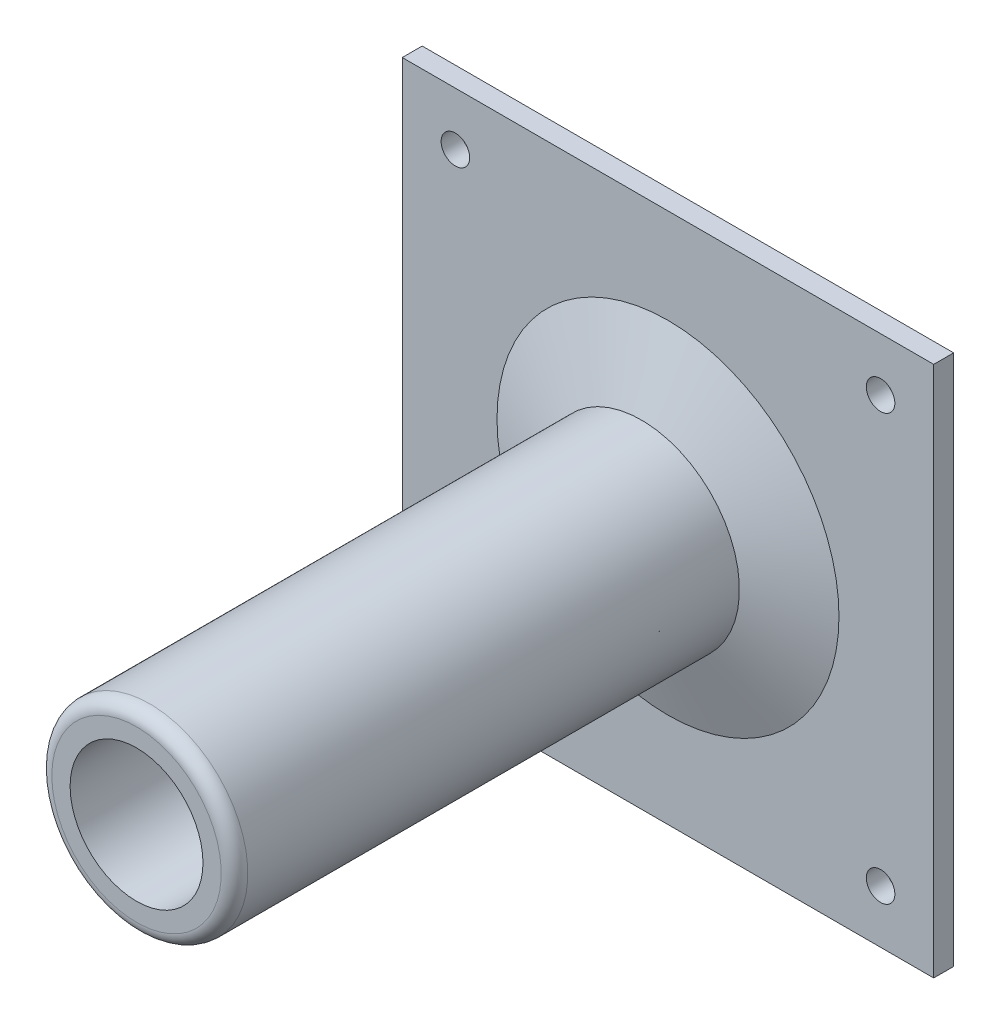
ISO-10303-21;
HEADER;
FILE_DESCRIPTION(('STEP AP214'),'2;1');
FILE_NAME('part.step','',(''),(''),'','','');
FILE_SCHEMA(('AUTOMOTIVE_DESIGN { 1 0 10303 214 1 1 1 1 }'));
ENDSEC;
DATA;
#1=APPLICATION_CONTEXT('core data for automotive mechanical design processes');
#2=APPLICATION_PROTOCOL_DEFINITION('international standard','automotive_design',2000,#1);
#3=PRODUCT_CONTEXT('',#1,'mechanical');
#4=PRODUCT('Part','Part','',(#3));
#5=PRODUCT_RELATED_PRODUCT_CATEGORY('part','',(#4));
#6=PRODUCT_DEFINITION_FORMATION('','',#4);
#7=PRODUCT_DEFINITION_CONTEXT('part definition',#1,'design');
#8=PRODUCT_DEFINITION('design','',#6,#7);
#9=PRODUCT_DEFINITION_SHAPE('','',#8);
#10=(LENGTH_UNIT() NAMED_UNIT(*) SI_UNIT(.MILLI.,.METRE.));
#11=(NAMED_UNIT(*) PLANE_ANGLE_UNIT() SI_UNIT($,.RADIAN.));
#12=(NAMED_UNIT(*) SI_UNIT($,.STERADIAN.) SOLID_ANGLE_UNIT());
#13=UNCERTAINTY_MEASURE_WITH_UNIT(LENGTH_MEASURE(1.E-05),#10,'distance_accuracy_value','');
#14=(GEOMETRIC_REPRESENTATION_CONTEXT(3) GLOBAL_UNCERTAINTY_ASSIGNED_CONTEXT((#13)) GLOBAL_UNIT_ASSIGNED_CONTEXT((#10,
#11,#12)) REPRESENTATION_CONTEXT('',''));
#15=CARTESIAN_POINT('',(0.,0.,0.));
#16=DIRECTION('',(0.,0.,1.));
#17=DIRECTION('',(1.,0.,0.));
#18=AXIS2_PLACEMENT_3D('',#15,#16,#17);
#19=CARTESIAN_POINT('',(0.,0.,3.));
#20=DIRECTION('',(0.,0.,-1.));
#21=DIRECTION('',(-1.,0.,0.));
#22=AXIS2_PLACEMENT_3D('',#19,#20,#21);
#23=PLANE('',#22);
#24=CARTESIAN_POINT('',(-32.,32.,3.));
#25=DIRECTION('',(0.,0.,1.));
#26=DIRECTION('',(1.,0.,0.));
#27=AXIS2_PLACEMENT_3D('',#24,#25,#26);
#28=CIRCLE('',#27,2.15);
#29=CARTESIAN_POINT('',(-29.85,32.,3.));
#30=VERTEX_POINT('',#29);
#31=EDGE_CURVE('E218',#30,#30,#28,.T.);
#32=ORIENTED_EDGE('',*,*,#31,.F.);
#33=EDGE_LOOP('',(#32));
#34=FACE_BOUND('',#33,.T.);
#35=CARTESIAN_POINT('',(32.,-32.,3.));
#36=DIRECTION('',(0.,0.,1.));
#37=DIRECTION('',(1.,0.,0.));
#38=AXIS2_PLACEMENT_3D('',#35,#36,#37);
#39=CIRCLE('',#38,2.15);
#40=CARTESIAN_POINT('',(34.15,-32.,3.));
#41=VERTEX_POINT('',#40);
#42=EDGE_CURVE('E232',#41,#41,#39,.T.);
#43=ORIENTED_EDGE('',*,*,#42,.F.);
#44=EDGE_LOOP('',(#43));
#45=FACE_BOUND('',#44,.T.);
#46=CARTESIAN_POINT('',(0.,0.,3.));
#47=DIRECTION('',(0.,0.,-1.));
#48=DIRECTION('',(-1.,0.,0.));
#49=AXIS2_PLACEMENT_3D('',#46,#47,#48);
#50=CIRCLE('',#49,25.7399096778187);
#51=CARTESIAN_POINT('',(-25.7399096778187,0.,3.));
#52=VERTEX_POINT('',#51);
#53=EDGE_CURVE('E117',#52,#52,#50,.T.);
#54=ORIENTED_EDGE('',*,*,#53,.T.);
#55=EDGE_LOOP('',(#54));
#56=FACE_BOUND('',#55,.T.);
#57=DIRECTION('',(0.,1.,0.));
#58=VECTOR('',#57,1.);
#59=CARTESIAN_POINT('',(40.,-40.,3.));
#60=LINE('',#59,#58);
#61=CARTESIAN_POINT('',(40.,-40.,3.));
#62=VERTEX_POINT('',#61);
#63=CARTESIAN_POINT('',(40.,40.,3.));
#64=VERTEX_POINT('',#63);
#65=EDGE_CURVE('E86',#62,#64,#60,.T.);
#66=ORIENTED_EDGE('',*,*,#65,.T.);
#67=DIRECTION('',(-1.,0.,0.));
#68=VECTOR('',#67,1.);
#69=CARTESIAN_POINT('',(-40.,40.,3.));
#70=LINE('',#69,#68);
#71=CARTESIAN_POINT('',(-40.,40.,3.));
#72=VERTEX_POINT('',#71);
#73=EDGE_CURVE('E81',#64,#72,#70,.T.);
#74=ORIENTED_EDGE('',*,*,#73,.T.);
#75=DIRECTION('',(0.,-1.,0.));
#76=VECTOR('',#75,1.);
#77=CARTESIAN_POINT('',(-40.,-40.,3.));
#78=LINE('',#77,#76);
#79=CARTESIAN_POINT('',(-40.,-40.,3.));
#80=VERTEX_POINT('',#79);
#81=EDGE_CURVE('E84',#72,#80,#78,.T.);
#82=ORIENTED_EDGE('',*,*,#81,.T.);
#83=DIRECTION('',(1.,0.,0.));
#84=VECTOR('',#83,1.);
#85=CARTESIAN_POINT('',(-40.,-40.,3.));
#86=LINE('',#85,#84);
#87=EDGE_CURVE('E50',#80,#62,#86,.T.);
#88=ORIENTED_EDGE('',*,*,#87,.T.);
#89=EDGE_LOOP('',(#66,#74,#82,#88));
#90=FACE_BOUND('',#89,.T.);
#91=CARTESIAN_POINT('',(32.,32.,3.));
#92=DIRECTION('',(0.,0.,1.));
#93=DIRECTION('',(1.,0.,0.));
#94=AXIS2_PLACEMENT_3D('',#91,#92,#93);
#95=CIRCLE('',#94,2.15);
#96=CARTESIAN_POINT('',(34.15,32.,3.));
#97=VERTEX_POINT('',#96);
#98=EDGE_CURVE('E226',#97,#97,#95,.T.);
#99=ORIENTED_EDGE('',*,*,#98,.F.);
#100=EDGE_LOOP('',(#99));
#101=FACE_BOUND('',#100,.T.);
#102=CARTESIAN_POINT('',(-32.,-32.,3.));
#103=DIRECTION('',(0.,0.,1.));
#104=DIRECTION('',(1.,0.,0.));
#105=AXIS2_PLACEMENT_3D('',#102,#103,#104);
#106=CIRCLE('',#105,2.15);
#107=CARTESIAN_POINT('',(-29.85,-32.,3.));
#108=VERTEX_POINT('',#107);
#109=EDGE_CURVE('E215',#108,#108,#106,.T.);
#110=ORIENTED_EDGE('',*,*,#109,.F.);
#111=EDGE_LOOP('',(#110));
#112=FACE_BOUND('',#111,.T.);
#113=ADVANCED_FACE('F33',(#34,#45,#56,#90,#101,#112),#23,.F.);
#114=CARTESIAN_POINT('',(40.,-40.,3.));
#115=DIRECTION('',(-1.,0.,0.));
#116=DIRECTION('',(0.,0.,1.));
#117=AXIS2_PLACEMENT_3D('',#114,#115,#116);
#118=PLANE('',#117);
#119=DIRECTION('',(0.,1.,0.));
#120=VECTOR('',#119,1.);
#121=CARTESIAN_POINT('',(40.,-40.,0.));
#122=LINE('',#121,#120);
#123=CARTESIAN_POINT('',(40.,-40.,0.));
#124=VERTEX_POINT('',#123);
#125=CARTESIAN_POINT('',(40.,40.,0.));
#126=VERTEX_POINT('',#125);
#127=EDGE_CURVE('E101',#124,#126,#122,.T.);
#128=ORIENTED_EDGE('',*,*,#127,.T.);
#129=DIRECTION('',(0.,0.,-1.));
#130=VECTOR('',#129,1.);
#131=CARTESIAN_POINT('',(40.,40.,3.));
#132=LINE('',#131,#130);
#133=EDGE_CURVE('E92',#64,#126,#132,.T.);
#134=ORIENTED_EDGE('',*,*,#133,.F.);
#135=ORIENTED_EDGE('',*,*,#65,.F.);
#136=DIRECTION('',(0.,0.,-1.));
#137=VECTOR('',#136,1.);
#138=CARTESIAN_POINT('',(40.,-40.,3.));
#139=LINE('',#138,#137);
#140=EDGE_CURVE('E97',#62,#124,#139,.T.);
#141=ORIENTED_EDGE('',*,*,#140,.T.);
#142=EDGE_LOOP('',(#128,#134,#135,#141));
#143=FACE_BOUND('',#142,.T.);
#144=ADVANCED_FACE('F144',(#143),#118,.F.);
#145=CARTESIAN_POINT('',(-40.,40.,3.));
#146=DIRECTION('',(0.,-1.,0.));
#147=DIRECTION('',(0.,0.,-1.));
#148=AXIS2_PLACEMENT_3D('',#145,#146,#147);
#149=PLANE('',#148);
#150=DIRECTION('',(-1.,0.,0.));
#151=VECTOR('',#150,1.);
#152=CARTESIAN_POINT('',(-40.,40.,0.));
#153=LINE('',#152,#151);
#154=CARTESIAN_POINT('',(-40.,40.,0.));
#155=VERTEX_POINT('',#154);
#156=EDGE_CURVE('E91',#126,#155,#153,.T.);
#157=ORIENTED_EDGE('',*,*,#156,.T.);
#158=DIRECTION('',(0.,0.,-1.));
#159=VECTOR('',#158,1.);
#160=CARTESIAN_POINT('',(-40.,40.,3.));
#161=LINE('',#160,#159);
#162=EDGE_CURVE('E89',#72,#155,#161,.T.);
#163=ORIENTED_EDGE('',*,*,#162,.F.);
#164=ORIENTED_EDGE('',*,*,#73,.F.);
#165=ORIENTED_EDGE('',*,*,#133,.T.);
#166=EDGE_LOOP('',(#157,#163,#164,#165));
#167=FACE_BOUND('',#166,.T.);
#168=ADVANCED_FACE('F90',(#167),#149,.F.);
#169=CARTESIAN_POINT('',(-40.,-40.,3.));
#170=DIRECTION('',(1.,0.,0.));
#171=DIRECTION('',(0.,0.,-1.));
#172=AXIS2_PLACEMENT_3D('',#169,#170,#171);
#173=PLANE('',#172);
#174=DIRECTION('',(0.,-1.,0.));
#175=VECTOR('',#174,1.);
#176=CARTESIAN_POINT('',(-40.,-40.,0.));
#177=LINE('',#176,#175);
#178=CARTESIAN_POINT('',(-40.,-40.,0.));
#179=VERTEX_POINT('',#178);
#180=EDGE_CURVE('E67',#155,#179,#177,.T.);
#181=ORIENTED_EDGE('',*,*,#180,.T.);
#182=DIRECTION('',(0.,0.,-1.));
#183=VECTOR('',#182,1.);
#184=CARTESIAN_POINT('',(-40.,-40.,3.));
#185=LINE('',#184,#183);
#186=EDGE_CURVE('E93',#80,#179,#185,.T.);
#187=ORIENTED_EDGE('',*,*,#186,.F.);
#188=ORIENTED_EDGE('',*,*,#81,.F.);
#189=ORIENTED_EDGE('',*,*,#162,.T.);
#190=EDGE_LOOP('',(#181,#187,#188,#189));
#191=FACE_BOUND('',#190,.T.);
#192=ADVANCED_FACE('F95',(#191),#173,.F.);
#193=CARTESIAN_POINT('',(-40.,-40.,3.));
#194=DIRECTION('',(0.,1.,0.));
#195=DIRECTION('',(0.,0.,1.));
#196=AXIS2_PLACEMENT_3D('',#193,#194,#195);
#197=PLANE('',#196);
#198=DIRECTION('',(1.,0.,0.));
#199=VECTOR('',#198,1.);
#200=CARTESIAN_POINT('',(-40.,-40.,0.));
#201=LINE('',#200,#199);
#202=EDGE_CURVE('E73',#179,#124,#201,.T.);
#203=ORIENTED_EDGE('',*,*,#202,.T.);
#204=ORIENTED_EDGE('',*,*,#140,.F.);
#205=ORIENTED_EDGE('',*,*,#87,.F.);
#206=ORIENTED_EDGE('',*,*,#186,.T.);
#207=EDGE_LOOP('',(#203,#204,#205,#206));
#208=FACE_BOUND('',#207,.T.);
#209=ADVANCED_FACE('F161',(#208),#197,.F.);
#210=CARTESIAN_POINT('',(0.,0.,0.));
#211=DIRECTION('',(0.,0.,-1.));
#212=DIRECTION('',(-1.,0.,0.));
#213=AXIS2_PLACEMENT_3D('',#210,#211,#212);
#214=PLANE('',#213);
#215=CARTESIAN_POINT('',(-32.,-32.,1.11022302462516E-13));
#216=DIRECTION('',(0.,0.,1.));
#217=DIRECTION('',(1.,0.,0.));
#218=AXIS2_PLACEMENT_3D('',#215,#216,#217);
#219=CIRCLE('',#218,2.15);
#220=CARTESIAN_POINT('',(-29.85,-32.,1.11022302462516E-13));
#221=VERTEX_POINT('',#220);
#222=EDGE_CURVE('E212',#221,#221,#219,.T.);
#223=ORIENTED_EDGE('',*,*,#222,.T.);
#224=EDGE_LOOP('',(#223));
#225=FACE_BOUND('',#224,.T.);
#226=CARTESIAN_POINT('',(-32.,32.,1.11022302462516E-13));
#227=DIRECTION('',(0.,0.,1.));
#228=DIRECTION('',(1.,0.,0.));
#229=AXIS2_PLACEMENT_3D('',#226,#227,#228);
#230=CIRCLE('',#229,2.15);
#231=CARTESIAN_POINT('',(-29.85,32.,1.11022302462516E-13));
#232=VERTEX_POINT('',#231);
#233=EDGE_CURVE('E223',#232,#232,#230,.T.);
#234=ORIENTED_EDGE('',*,*,#233,.T.);
#235=EDGE_LOOP('',(#234));
#236=FACE_BOUND('',#235,.T.);
#237=CARTESIAN_POINT('',(32.,32.,1.11022302462516E-13));
#238=DIRECTION('',(0.,0.,1.));
#239=DIRECTION('',(1.,0.,0.));
#240=AXIS2_PLACEMENT_3D('',#237,#238,#239);
#241=CIRCLE('',#240,2.15);
#242=CARTESIAN_POINT('',(34.15,32.,1.11022302462516E-13));
#243=VERTEX_POINT('',#242);
#244=EDGE_CURVE('E229',#243,#243,#241,.T.);
#245=ORIENTED_EDGE('',*,*,#244,.T.);
#246=EDGE_LOOP('',(#245));
#247=FACE_BOUND('',#246,.T.);
#248=CARTESIAN_POINT('',(32.,-32.,1.11022302462516E-13));
#249=DIRECTION('',(0.,0.,1.));
#250=DIRECTION('',(1.,0.,0.));
#251=AXIS2_PLACEMENT_3D('',#248,#249,#250);
#252=CIRCLE('',#251,2.15);
#253=CARTESIAN_POINT('',(34.15,-32.,1.11022302462516E-13));
#254=VERTEX_POINT('',#253);
#255=EDGE_CURVE('E235',#254,#254,#252,.T.);
#256=ORIENTED_EDGE('',*,*,#255,.T.);
#257=EDGE_LOOP('',(#256));
#258=FACE_BOUND('',#257,.T.);
#259=CARTESIAN_POINT('',(0.,0.,0.));
#260=DIRECTION('',(0.,0.,-1.));
#261=DIRECTION('',(-1.,0.,0.));
#262=AXIS2_PLACEMENT_3D('',#259,#260,#261);
#263=CIRCLE('',#262,15.);
#264=CARTESIAN_POINT('',(-15.,0.,0.));
#265=VERTEX_POINT('',#264);
#266=EDGE_CURVE('E42',#265,#265,#263,.F.);
#267=ORIENTED_EDGE('',*,*,#266,.T.);
#268=EDGE_LOOP('',(#267));
#269=FACE_BOUND('',#268,.T.);
#270=ORIENTED_EDGE('',*,*,#127,.F.);
#271=ORIENTED_EDGE('',*,*,#202,.F.);
#272=ORIENTED_EDGE('',*,*,#180,.F.);
#273=ORIENTED_EDGE('',*,*,#156,.F.);
#274=EDGE_LOOP('',(#270,#271,#272,#273));
#275=FACE_BOUND('',#274,.T.);
#276=ADVANCED_FACE('F125',(#225,#236,#247,#258,#269,#275),#214,.T.);
#277=CARTESIAN_POINT('',(0.,0.,83.));
#278=DIRECTION('',(0.,0.,-1.));
#279=DIRECTION('',(-1.,0.,0.));
#280=AXIS2_PLACEMENT_3D('',#277,#278,#279);
#281=CYLINDRICAL_SURFACE('',#280,14.75);
#282=CARTESIAN_POINT('',(0.,0.,6.99999999999999));
#283=DIRECTION('',(0.,0.,-1.));
#284=DIRECTION('',(-1.,0.,0.));
#285=AXIS2_PLACEMENT_3D('',#282,#283,#284);
#286=CIRCLE('',#285,14.75);
#287=CARTESIAN_POINT('',(-14.75,0.,6.99999999999999));
#288=VERTEX_POINT('',#287);
#289=EDGE_CURVE('E120',#288,#288,#286,.F.);
#290=ORIENTED_EDGE('',*,*,#289,.T.);
#291=EDGE_LOOP('',(#290));
#292=FACE_BOUND('',#291,.T.);
#293=CARTESIAN_POINT('',(0.,0.,81.));
#294=DIRECTION('',(0.,0.,-1.));
#295=DIRECTION('',(-1.,0.,0.));
#296=AXIS2_PLACEMENT_3D('',#293,#294,#295);
#297=CIRCLE('',#296,14.75);
#298=CARTESIAN_POINT('',(-14.75,0.,81.));
#299=VERTEX_POINT('',#298);
#300=EDGE_CURVE('E111',#299,#299,#297,.T.);
#301=ORIENTED_EDGE('',*,*,#300,.T.);
#302=EDGE_LOOP('',(#301));
#303=FACE_BOUND('',#302,.T.);
#304=ADVANCED_FACE('F158',(#292,#303),#281,.T.);
#305=CARTESIAN_POINT('',(0.,0.,83.));
#306=DIRECTION('',(0.,0.,-1.));
#307=DIRECTION('',(-1.,0.,0.));
#308=AXIS2_PLACEMENT_3D('',#305,#306,#307);
#309=PLANE('',#308);
#310=CARTESIAN_POINT('',(0.,0.,83.));
#311=DIRECTION('',(0.,0.,1.));
#312=DIRECTION('',(1.,0.,0.));
#313=AXIS2_PLACEMENT_3D('',#310,#311,#312);
#314=CIRCLE('',#313,10.);
#315=CARTESIAN_POINT('',(10.,0.,83.));
#316=VERTEX_POINT('',#315);
#317=EDGE_CURVE('E104',#316,#316,#314,.T.);
#318=ORIENTED_EDGE('',*,*,#317,.F.);
#319=EDGE_LOOP('',(#318));
#320=FACE_BOUND('',#319,.T.);
#321=CARTESIAN_POINT('',(0.,0.,83.));
#322=DIRECTION('',(0.,0.,-1.));
#323=DIRECTION('',(-1.,0.,0.));
#324=AXIS2_PLACEMENT_3D('',#321,#322,#323);
#325=CIRCLE('',#324,12.75);
#326=CARTESIAN_POINT('',(-12.75,0.,83.));
#327=VERTEX_POINT('',#326);
#328=EDGE_CURVE('E114',#327,#327,#325,.F.);
#329=ORIENTED_EDGE('',*,*,#328,.T.);
#330=EDGE_LOOP('',(#329));
#331=FACE_BOUND('',#330,.T.);
#332=ADVANCED_FACE('F171',(#320,#331),#309,.F.);
#333=CARTESIAN_POINT('',(0.,0.,81.));
#334=DIRECTION('',(0.,0.,-1.));
#335=DIRECTION('',(-1.,0.,0.));
#336=AXIS2_PLACEMENT_3D('',#333,#334,#335);
#337=TOROIDAL_SURFACE('',#336,12.75,2.);
#338=ORIENTED_EDGE('',*,*,#328,.F.);
#339=EDGE_LOOP('',(#338));
#340=FACE_BOUND('',#339,.T.);
#341=ORIENTED_EDGE('',*,*,#300,.F.);
#342=EDGE_LOOP('',(#341));
#343=FACE_BOUND('',#342,.T.);
#344=ADVANCED_FACE('F169',(#340,#343),#337,.T.);
#345=CARTESIAN_POINT('',(0.,0.,3.));
#346=DIRECTION('',(0.,0.,-1.));
#347=DIRECTION('',(-1.,0.,0.));
#348=AXIS2_PLACEMENT_3D('',#345,#346,#347);
#349=CONICAL_SURFACE('',#348,25.7399096778187,1.22173047639604);
#350=ORIENTED_EDGE('',*,*,#289,.F.);
#351=EDGE_LOOP('',(#350));
#352=FACE_BOUND('',#351,.T.);
#353=ORIENTED_EDGE('',*,*,#53,.F.);
#354=EDGE_LOOP('',(#353));
#355=FACE_BOUND('',#354,.T.);
#356=ADVANCED_FACE('F139',(#352,#355),#349,.T.);
#357=CARTESIAN_POINT('',(0.,0.,83.));
#358=DIRECTION('',(0.,0.,-1.));
#359=DIRECTION('',(-1.,0.,0.));
#360=AXIS2_PLACEMENT_3D('',#357,#358,#359);
#361=CYLINDRICAL_SURFACE('',#360,10.);
#362=CARTESIAN_POINT('',(0.,0.,5.));
#363=DIRECTION('',(0.,0.,-1.));
#364=DIRECTION('',(-1.,0.,0.));
#365=AXIS2_PLACEMENT_3D('',#362,#363,#364);
#366=CIRCLE('',#365,10.);
#367=CARTESIAN_POINT('',(-10.,0.,5.));
#368=VERTEX_POINT('',#367);
#369=EDGE_CURVE('E11',#368,#368,#366,.T.);
#370=ORIENTED_EDGE('',*,*,#369,.T.);
#371=EDGE_LOOP('',(#370));
#372=FACE_BOUND('',#371,.T.);
#373=ORIENTED_EDGE('',*,*,#317,.T.);
#374=EDGE_LOOP('',(#373));
#375=FACE_BOUND('',#374,.T.);
#376=ADVANCED_FACE('F130',(#372,#375),#361,.F.);
#377=CARTESIAN_POINT('',(0.,0.,5.));
#378=DIRECTION('',(0.,0.,-1.));
#379=DIRECTION('',(-1.,0.,0.));
#380=AXIS2_PLACEMENT_3D('',#377,#378,#379);
#381=TOROIDAL_SURFACE('',#380,15.,5.);
#382=ORIENTED_EDGE('',*,*,#369,.F.);
#383=EDGE_LOOP('',(#382));
#384=FACE_BOUND('',#383,.T.);
#385=ORIENTED_EDGE('',*,*,#266,.F.);
#386=EDGE_LOOP('',(#385));
#387=FACE_BOUND('',#386,.T.);
#388=ADVANCED_FACE('F35',(#384,#387),#381,.T.);
#389=CARTESIAN_POINT('',(32.,-32.,3.));
#390=DIRECTION('',(0.,0.,1.));
#391=DIRECTION('',(1.,0.,0.));
#392=AXIS2_PLACEMENT_3D('',#389,#390,#391);
#393=CYLINDRICAL_SURFACE('',#392,2.15);
#394=ORIENTED_EDGE('',*,*,#255,.F.);
#395=EDGE_LOOP('',(#394));
#396=FACE_BOUND('',#395,.T.);
#397=ORIENTED_EDGE('',*,*,#42,.T.);
#398=EDGE_LOOP('',(#397));
#399=FACE_BOUND('',#398,.T.);
#400=ADVANCED_FACE('F129',(#396,#399),#393,.F.);
#401=CARTESIAN_POINT('',(32.,32.,3.));
#402=DIRECTION('',(0.,0.,1.));
#403=DIRECTION('',(1.,0.,0.));
#404=AXIS2_PLACEMENT_3D('',#401,#402,#403);
#405=CYLINDRICAL_SURFACE('',#404,2.15);
#406=ORIENTED_EDGE('',*,*,#244,.F.);
#407=EDGE_LOOP('',(#406));
#408=FACE_BOUND('',#407,.T.);
#409=ORIENTED_EDGE('',*,*,#98,.T.);
#410=EDGE_LOOP('',(#409));
#411=FACE_BOUND('',#410,.T.);
#412=ADVANCED_FACE('F136',(#408,#411),#405,.F.);
#413=CARTESIAN_POINT('',(-32.,32.,3.));
#414=DIRECTION('',(0.,0.,1.));
#415=DIRECTION('',(1.,0.,0.));
#416=AXIS2_PLACEMENT_3D('',#413,#414,#415);
#417=CYLINDRICAL_SURFACE('',#416,2.15);
#418=ORIENTED_EDGE('',*,*,#233,.F.);
#419=EDGE_LOOP('',(#418));
#420=FACE_BOUND('',#419,.T.);
#421=ORIENTED_EDGE('',*,*,#31,.T.);
#422=EDGE_LOOP('',(#421));
#423=FACE_BOUND('',#422,.T.);
#424=ADVANCED_FACE('F199',(#420,#423),#417,.F.);
#425=CARTESIAN_POINT('',(-32.,-32.,3.));
#426=DIRECTION('',(0.,0.,1.));
#427=DIRECTION('',(1.,0.,0.));
#428=AXIS2_PLACEMENT_3D('',#425,#426,#427);
#429=CYLINDRICAL_SURFACE('',#428,2.15);
#430=ORIENTED_EDGE('',*,*,#222,.F.);
#431=EDGE_LOOP('',(#430));
#432=FACE_BOUND('',#431,.T.);
#433=ORIENTED_EDGE('',*,*,#109,.T.);
#434=EDGE_LOOP('',(#433));
#435=FACE_BOUND('',#434,.T.);
#436=ADVANCED_FACE('F203',(#432,#435),#429,.F.);
#437=CLOSED_SHELL('',(#113,#144,#168,#192,#209,#276,#304,#332,#344,#356,#376,#388,#400,#412,
#424,#436));
#438=MANIFOLD_SOLID_BREP('B2',#437);
#439=ADVANCED_BREP_SHAPE_REPRESENTATION('',(#18,#438),#14);
#440=SHAPE_DEFINITION_REPRESENTATION(#9,#439);
ENDSEC;
END-ISO-10303-21;
